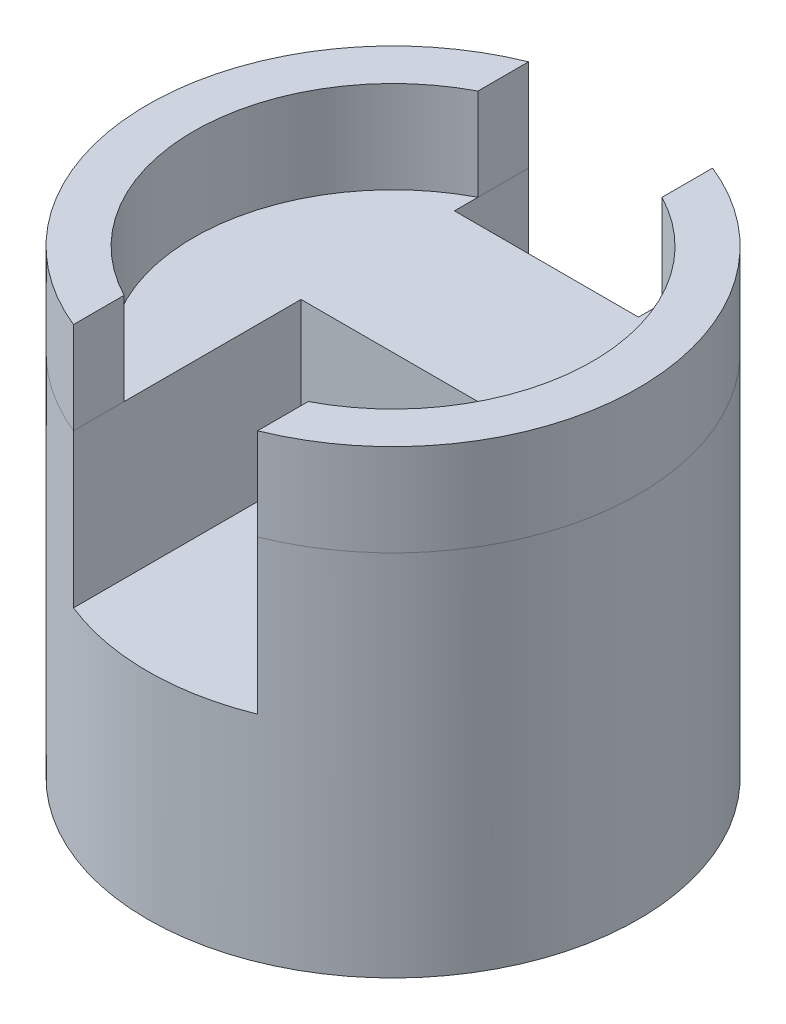
ISO-10303-21;
HEADER;
FILE_DESCRIPTION(('STEP AP214'),'2;1');
FILE_NAME('part.step','',(''),(''),'','','');
FILE_SCHEMA(('AUTOMOTIVE_DESIGN { 1 0 10303 214 1 1 1 1 }'));
ENDSEC;
DATA;
#1=APPLICATION_CONTEXT('core data for automotive mechanical design processes');
#2=APPLICATION_PROTOCOL_DEFINITION('international standard','automotive_design',2000,#1);
#3=PRODUCT_CONTEXT('',#1,'mechanical');
#4=PRODUCT('Part','Part','',(#3));
#5=PRODUCT_RELATED_PRODUCT_CATEGORY('part','',(#4));
#6=PRODUCT_DEFINITION_FORMATION('','',#4);
#7=PRODUCT_DEFINITION_CONTEXT('part definition',#1,'design');
#8=PRODUCT_DEFINITION('design','',#6,#7);
#9=PRODUCT_DEFINITION_SHAPE('','',#8);
#10=(LENGTH_UNIT() NAMED_UNIT(*) SI_UNIT(.MILLI.,.METRE.));
#11=(NAMED_UNIT(*) PLANE_ANGLE_UNIT() SI_UNIT($,.RADIAN.));
#12=(NAMED_UNIT(*) SI_UNIT($,.STERADIAN.) SOLID_ANGLE_UNIT());
#13=UNCERTAINTY_MEASURE_WITH_UNIT(LENGTH_MEASURE(1.E-05),#10,'distance_accuracy_value','');
#14=(GEOMETRIC_REPRESENTATION_CONTEXT(3) GLOBAL_UNCERTAINTY_ASSIGNED_CONTEXT((#13)) GLOBAL_UNIT_ASSIGNED_CONTEXT((#10,
#11,#12)) REPRESENTATION_CONTEXT('',''));
#15=CARTESIAN_POINT('',(0.,0.,0.));
#16=DIRECTION('',(0.,0.,1.));
#17=DIRECTION('',(1.,0.,0.));
#18=AXIS2_PLACEMENT_3D('',#15,#16,#17);
#19=CARTESIAN_POINT('',(0.,190.5,0.));
#20=DIRECTION('',(0.,1.,0.));
#21=DIRECTION('',(0.,0.,1.));
#22=AXIS2_PLACEMENT_3D('',#19,#20,#21);
#23=PLANE('',#22);
#24=DIRECTION('',(0.,0.,1.));
#25=VECTOR('',#24,1.);
#26=CARTESIAN_POINT('',(-38.1,190.5,-63.5));
#27=LINE('',#26,#25);
#28=CARTESIAN_POINT('',(-38.1,190.5,-94.1857207861149));
#29=VERTEX_POINT('',#28);
#30=CARTESIAN_POINT('',(-38.1,190.5,-73.2317724761596));
#31=VERTEX_POINT('',#30);
#32=EDGE_CURVE('E58',#29,#31,#27,.T.);
#33=ORIENTED_EDGE('',*,*,#32,.F.);
#34=CARTESIAN_POINT('',(0.,190.5,0.));
#35=DIRECTION('',(0.,1.,0.));
#36=DIRECTION('',(0.,0.,1.));
#37=AXIS2_PLACEMENT_3D('',#34,#35,#36);
#38=CIRCLE('',#37,101.6);
#39=CARTESIAN_POINT('',(-38.1,190.5,94.1857207861149));
#40=VERTEX_POINT('',#39);
#41=EDGE_CURVE('E112',#29,#40,#38,.T.);
#42=ORIENTED_EDGE('',*,*,#41,.T.);
#43=DIRECTION('',(0.,0.,1.));
#44=VECTOR('',#43,1.);
#45=CARTESIAN_POINT('',(-38.1,190.5,0.));
#46=LINE('',#45,#44);
#47=CARTESIAN_POINT('',(-38.1,190.5,73.2317724761595));
#48=VERTEX_POINT('',#47);
#49=EDGE_CURVE('E91',#48,#40,#46,.T.);
#50=ORIENTED_EDGE('',*,*,#49,.F.);
#51=CARTESIAN_POINT('',(0.,190.5,0.));
#52=DIRECTION('',(0.,1.,0.));
#53=DIRECTION('',(0.,0.,1.));
#54=AXIS2_PLACEMENT_3D('',#51,#52,#53);
#55=CIRCLE('',#54,82.55);
#56=EDGE_CURVE('E97',#31,#48,#55,.T.);
#57=ORIENTED_EDGE('',*,*,#56,.F.);
#58=EDGE_LOOP('',(#33,#42,#50,#57));
#59=FACE_BOUND('',#58,.T.);
#60=ADVANCED_FACE('F55',(#59),#23,.T.);
#61=CARTESIAN_POINT('',(0.,152.4,0.));
#62=DIRECTION('',(0.,1.,0.));
#63=DIRECTION('',(0.,0.,1.));
#64=AXIS2_PLACEMENT_3D('',#61,#62,#63);
#65=PLANE('',#64);
#66=CARTESIAN_POINT('',(0.,152.4,0.));
#67=DIRECTION('',(0.,1.,0.));
#68=DIRECTION('',(0.,0.,1.));
#69=AXIS2_PLACEMENT_3D('',#66,#67,#68);
#70=CIRCLE('',#69,101.6);
#71=CARTESIAN_POINT('',(-38.1,152.4,-94.1857207861149));
#72=VERTEX_POINT('',#71);
#73=CARTESIAN_POINT('',(-38.1,152.4,94.1857207861149));
#74=VERTEX_POINT('',#73);
#75=EDGE_CURVE('E110',#72,#74,#70,.T.);
#76=ORIENTED_EDGE('',*,*,#75,.F.);
#77=DIRECTION('',(0.,0.,1.));
#78=VECTOR('',#77,1.);
#79=CARTESIAN_POINT('',(-38.1,152.4,0.));
#80=LINE('',#79,#78);
#81=CARTESIAN_POINT('',(-38.1,152.4,-73.2317724761595));
#82=VERTEX_POINT('',#81);
#83=EDGE_CURVE('E71',#72,#82,#80,.T.);
#84=ORIENTED_EDGE('',*,*,#83,.T.);
#85=CARTESIAN_POINT('',(0.,152.4,0.));
#86=DIRECTION('',(0.,1.,0.));
#87=DIRECTION('',(0.,0.,1.));
#88=AXIS2_PLACEMENT_3D('',#85,#86,#87);
#89=CIRCLE('',#88,82.55);
#90=CARTESIAN_POINT('',(-38.1,152.4,73.2317724761595));
#91=VERTEX_POINT('',#90);
#92=EDGE_CURVE('E54',#82,#91,#89,.T.);
#93=ORIENTED_EDGE('',*,*,#92,.T.);
#94=DIRECTION('',(0.,0.,1.));
#95=VECTOR('',#94,1.);
#96=CARTESIAN_POINT('',(-38.1,152.4,0.));
#97=LINE('',#96,#95);
#98=EDGE_CURVE('E113',#91,#74,#97,.T.);
#99=ORIENTED_EDGE('',*,*,#98,.T.);
#100=EDGE_LOOP('',(#76,#84,#93,#99));
#101=FACE_BOUND('',#100,.T.);
#102=ADVANCED_FACE('F122',(#101),#65,.F.);
#103=CARTESIAN_POINT('',(0.,190.5,0.));
#104=DIRECTION('',(0.,-1.,0.));
#105=DIRECTION('',(0.,0.,-1.));
#106=AXIS2_PLACEMENT_3D('',#103,#104,#105);
#107=CYLINDRICAL_SURFACE('',#106,101.6);
#108=ORIENTED_EDGE('',*,*,#41,.F.);
#109=DIRECTION('',(0.,-1.,0.));
#110=VECTOR('',#109,1.);
#111=CARTESIAN_POINT('',(-38.1,190.5,-94.1857207861149));
#112=LINE('',#111,#110);
#113=EDGE_CURVE('E69',#29,#72,#112,.T.);
#114=ORIENTED_EDGE('',*,*,#113,.T.);
#115=ORIENTED_EDGE('',*,*,#75,.T.);
#116=DIRECTION('',(0.,-1.,0.));
#117=VECTOR('',#116,1.);
#118=CARTESIAN_POINT('',(-38.1,190.5,94.1857207861149));
#119=LINE('',#118,#117);
#120=EDGE_CURVE('E102',#74,#40,#119,.F.);
#121=ORIENTED_EDGE('',*,*,#120,.T.);
#122=EDGE_LOOP('',(#108,#114,#115,#121));
#123=FACE_BOUND('',#122,.T.);
#124=ADVANCED_FACE('F127',(#123),#107,.T.);
#125=CARTESIAN_POINT('',(0.,190.5,0.));
#126=DIRECTION('',(0.,-1.,0.));
#127=DIRECTION('',(0.,0.,-1.));
#128=AXIS2_PLACEMENT_3D('',#125,#126,#127);
#129=CYLINDRICAL_SURFACE('',#128,82.55);
#130=DIRECTION('',(0.,-1.,0.));
#131=VECTOR('',#130,1.);
#132=CARTESIAN_POINT('',(-38.1,190.5,-73.2317724761595));
#133=LINE('',#132,#131);
#134=EDGE_CURVE('E12',#31,#82,#133,.T.);
#135=ORIENTED_EDGE('',*,*,#134,.F.);
#136=ORIENTED_EDGE('',*,*,#56,.T.);
#137=DIRECTION('',(0.,-1.,0.));
#138=VECTOR('',#137,1.);
#139=CARTESIAN_POINT('',(-38.1,190.5,73.2317724761595));
#140=LINE('',#139,#138);
#141=EDGE_CURVE('E103',#91,#48,#140,.F.);
#142=ORIENTED_EDGE('',*,*,#141,.F.);
#143=ORIENTED_EDGE('',*,*,#92,.F.);
#144=EDGE_LOOP('',(#135,#136,#142,#143));
#145=FACE_BOUND('',#144,.T.);
#146=ADVANCED_FACE('F100',(#145),#129,.F.);
#147=CARTESIAN_POINT('',(-38.1,88.9,0.));
#148=DIRECTION('',(-1.,0.,0.));
#149=DIRECTION('',(0.,0.,1.));
#150=AXIS2_PLACEMENT_3D('',#147,#148,#149);
#151=PLANE('',#150);
#152=ORIENTED_EDGE('',*,*,#98,.F.);
#153=ORIENTED_EDGE('',*,*,#141,.T.);
#154=ORIENTED_EDGE('',*,*,#49,.T.);
#155=ORIENTED_EDGE('',*,*,#120,.F.);
#156=EDGE_LOOP('',(#152,#153,#154,#155));
#157=FACE_BOUND('',#156,.T.);
#158=ADVANCED_FACE('F121',(#157),#151,.F.);
#159=CARTESIAN_POINT('',(-38.1,0.,-63.5));
#160=DIRECTION('',(-1.,0.,0.));
#161=DIRECTION('',(0.,0.,1.));
#162=AXIS2_PLACEMENT_3D('',#159,#160,#161);
#163=PLANE('',#162);
#164=ORIENTED_EDGE('',*,*,#32,.T.);
#165=ORIENTED_EDGE('',*,*,#134,.T.);
#166=ORIENTED_EDGE('',*,*,#83,.F.);
#167=ORIENTED_EDGE('',*,*,#113,.F.);
#168=EDGE_LOOP('',(#164,#165,#166,#167));
#169=FACE_BOUND('',#168,.T.);
#170=ADVANCED_FACE('F90',(#169),#163,.F.);
#171=CLOSED_SHELL('',(#60,#102,#124,#146,#158,#170));
#172=MANIFOLD_SOLID_BREP('B2',#171);
#173=CARTESIAN_POINT('',(38.1,88.9,0.));
#174=DIRECTION('',(1.,0.,0.));
#175=DIRECTION('',(0.,0.,-1.));
#176=AXIS2_PLACEMENT_3D('',#173,#174,#175);
#177=PLANE('',#176);
#178=DIRECTION('',(0.,0.,-1.));
#179=VECTOR('',#178,1.);
#180=CARTESIAN_POINT('',(38.1,190.5,0.));
#181=LINE('',#180,#179);
#182=CARTESIAN_POINT('',(38.1,190.5,94.1857207861149));
#183=VERTEX_POINT('',#182);
#184=CARTESIAN_POINT('',(38.1,190.5,73.2317724761595));
#185=VERTEX_POINT('',#184);
#186=EDGE_CURVE('E210',#183,#185,#181,.T.);
#187=ORIENTED_EDGE('',*,*,#186,.T.);
#188=DIRECTION('',(0.,-1.,0.));
#189=VECTOR('',#188,1.);
#190=CARTESIAN_POINT('',(38.1,190.5,73.2317724761595));
#191=LINE('',#190,#189);
#192=CARTESIAN_POINT('',(38.1,152.4,73.2317724761595));
#193=VERTEX_POINT('',#192);
#194=EDGE_CURVE('E194',#185,#193,#191,.T.);
#195=ORIENTED_EDGE('',*,*,#194,.T.);
#196=DIRECTION('',(0.,0.,-1.));
#197=VECTOR('',#196,1.);
#198=CARTESIAN_POINT('',(38.1,152.4,0.));
#199=LINE('',#198,#197);
#200=CARTESIAN_POINT('',(38.1,152.4,94.1857207861149));
#201=VERTEX_POINT('',#200);
#202=EDGE_CURVE('E248',#201,#193,#199,.T.);
#203=ORIENTED_EDGE('',*,*,#202,.F.);
#204=DIRECTION('',(0.,-1.,0.));
#205=VECTOR('',#204,1.);
#206=CARTESIAN_POINT('',(38.1,190.5,94.1857207861149));
#207=LINE('',#206,#205);
#208=EDGE_CURVE('E241',#183,#201,#207,.T.);
#209=ORIENTED_EDGE('',*,*,#208,.F.);
#210=EDGE_LOOP('',(#187,#195,#203,#209));
#211=FACE_BOUND('',#210,.T.);
#212=ADVANCED_FACE('F183',(#211),#177,.F.);
#213=CARTESIAN_POINT('',(0.,190.5,0.));
#214=DIRECTION('',(0.,-1.,0.));
#215=DIRECTION('',(0.,0.,-1.));
#216=AXIS2_PLACEMENT_3D('',#213,#214,#215);
#217=CYLINDRICAL_SURFACE('',#216,101.6);
#218=CARTESIAN_POINT('',(0.,152.4,0.));
#219=DIRECTION('',(0.,1.,0.));
#220=DIRECTION('',(0.,0.,1.));
#221=AXIS2_PLACEMENT_3D('',#218,#219,#220);
#222=CIRCLE('',#221,101.6);
#223=CARTESIAN_POINT('',(38.1,152.4,-94.1857207861149));
#224=VERTEX_POINT('',#223);
#225=EDGE_CURVE('E239',#201,#224,#222,.T.);
#226=ORIENTED_EDGE('',*,*,#225,.T.);
#227=DIRECTION('',(0.,-1.,0.));
#228=VECTOR('',#227,1.);
#229=CARTESIAN_POINT('',(38.1,190.5,-94.1857207861149));
#230=LINE('',#229,#228);
#231=CARTESIAN_POINT('',(38.1,190.5,-94.1857207861149));
#232=VERTEX_POINT('',#231);
#233=EDGE_CURVE('E254',#224,#232,#230,.F.);
#234=ORIENTED_EDGE('',*,*,#233,.T.);
#235=CARTESIAN_POINT('',(0.,190.5,0.));
#236=DIRECTION('',(0.,1.,0.));
#237=DIRECTION('',(0.,0.,1.));
#238=AXIS2_PLACEMENT_3D('',#235,#236,#237);
#239=CIRCLE('',#238,101.6);
#240=EDGE_CURVE('E237',#183,#232,#239,.T.);
#241=ORIENTED_EDGE('',*,*,#240,.F.);
#242=ORIENTED_EDGE('',*,*,#208,.T.);
#243=EDGE_LOOP('',(#226,#234,#241,#242));
#244=FACE_BOUND('',#243,.T.);
#245=ADVANCED_FACE('F189',(#244),#217,.T.);
#246=CARTESIAN_POINT('',(0.,190.5,0.));
#247=DIRECTION('',(0.,-1.,0.));
#248=DIRECTION('',(0.,0.,-1.));
#249=AXIS2_PLACEMENT_3D('',#246,#247,#248);
#250=CYLINDRICAL_SURFACE('',#249,82.55);
#251=DIRECTION('',(0.,-1.,0.));
#252=VECTOR('',#251,1.);
#253=CARTESIAN_POINT('',(38.1,190.5,-73.2317724761595));
#254=LINE('',#253,#252);
#255=CARTESIAN_POINT('',(38.1,152.4,-73.2317724761596));
#256=VERTEX_POINT('',#255);
#257=CARTESIAN_POINT('',(38.1,190.5,-73.2317724761596));
#258=VERTEX_POINT('',#257);
#259=EDGE_CURVE('E49',#256,#258,#254,.F.);
#260=ORIENTED_EDGE('',*,*,#259,.F.);
#261=CARTESIAN_POINT('',(0.,152.4,0.));
#262=DIRECTION('',(0.,1.,0.));
#263=DIRECTION('',(0.,0.,1.));
#264=AXIS2_PLACEMENT_3D('',#261,#262,#263);
#265=CIRCLE('',#264,82.55);
#266=EDGE_CURVE('E238',#193,#256,#265,.T.);
#267=ORIENTED_EDGE('',*,*,#266,.F.);
#268=ORIENTED_EDGE('',*,*,#194,.F.);
#269=CARTESIAN_POINT('',(0.,190.5,0.));
#270=DIRECTION('',(0.,1.,0.));
#271=DIRECTION('',(0.,0.,1.));
#272=AXIS2_PLACEMENT_3D('',#269,#270,#271);
#273=CIRCLE('',#272,82.55);
#274=EDGE_CURVE('E231',#185,#258,#273,.T.);
#275=ORIENTED_EDGE('',*,*,#274,.T.);
#276=EDGE_LOOP('',(#260,#267,#268,#275));
#277=FACE_BOUND('',#276,.T.);
#278=ADVANCED_FACE('F236',(#277),#250,.F.);
#279=CARTESIAN_POINT('',(0.,152.4,0.));
#280=DIRECTION('',(0.,1.,0.));
#281=DIRECTION('',(0.,0.,1.));
#282=AXIS2_PLACEMENT_3D('',#279,#280,#281);
#283=PLANE('',#282);
#284=ORIENTED_EDGE('',*,*,#266,.T.);
#285=DIRECTION('',(0.,0.,-1.));
#286=VECTOR('',#285,1.);
#287=CARTESIAN_POINT('',(38.1,152.4,0.));
#288=LINE('',#287,#286);
#289=EDGE_CURVE('E200',#256,#224,#288,.T.);
#290=ORIENTED_EDGE('',*,*,#289,.T.);
#291=ORIENTED_EDGE('',*,*,#225,.F.);
#292=ORIENTED_EDGE('',*,*,#202,.T.);
#293=EDGE_LOOP('',(#284,#290,#291,#292));
#294=FACE_BOUND('',#293,.T.);
#295=ADVANCED_FACE('F255',(#294),#283,.F.);
#296=CARTESIAN_POINT('',(0.,190.5,0.));
#297=DIRECTION('',(0.,1.,0.));
#298=DIRECTION('',(0.,0.,1.));
#299=AXIS2_PLACEMENT_3D('',#296,#297,#298);
#300=PLANE('',#299);
#301=DIRECTION('',(0.,0.,-1.));
#302=VECTOR('',#301,1.);
#303=CARTESIAN_POINT('',(38.1,190.5,-63.5));
#304=LINE('',#303,#302);
#305=EDGE_CURVE('E221',#258,#232,#304,.T.);
#306=ORIENTED_EDGE('',*,*,#305,.F.);
#307=ORIENTED_EDGE('',*,*,#274,.F.);
#308=ORIENTED_EDGE('',*,*,#186,.F.);
#309=ORIENTED_EDGE('',*,*,#240,.T.);
#310=EDGE_LOOP('',(#306,#307,#308,#309));
#311=FACE_BOUND('',#310,.T.);
#312=ADVANCED_FACE('F234',(#311),#300,.T.);
#313=CARTESIAN_POINT('',(38.1,0.,-63.5));
#314=DIRECTION('',(1.,0.,0.));
#315=DIRECTION('',(0.,0.,-1.));
#316=AXIS2_PLACEMENT_3D('',#313,#314,#315);
#317=PLANE('',#316);
#318=ORIENTED_EDGE('',*,*,#289,.F.);
#319=ORIENTED_EDGE('',*,*,#259,.T.);
#320=ORIENTED_EDGE('',*,*,#305,.T.);
#321=ORIENTED_EDGE('',*,*,#233,.F.);
#322=EDGE_LOOP('',(#318,#319,#320,#321));
#323=FACE_BOUND('',#322,.T.);
#324=ADVANCED_FACE('F224',(#323),#317,.F.);
#325=CLOSED_SHELL('',(#212,#245,#278,#295,#312,#324));
#326=MANIFOLD_SOLID_BREP('B6',#325);
#327=CARTESIAN_POINT('',(0.,152.4,0.));
#328=DIRECTION('',(0.,-1.,0.));
#329=DIRECTION('',(0.,0.,-1.));
#330=AXIS2_PLACEMENT_3D('',#327,#328,#329);
#331=CYLINDRICAL_SURFACE('',#330,101.6);
#332=CARTESIAN_POINT('',(0.,152.4,0.));
#333=DIRECTION('',(0.,1.,0.));
#334=DIRECTION('',(0.,0.,1.));
#335=AXIS2_PLACEMENT_3D('',#332,#333,#334);
#336=CIRCLE('',#335,101.6);
#337=CARTESIAN_POINT('',(-38.1,152.4,-94.1857207861149));
#338=VERTEX_POINT('',#337);
#339=CARTESIAN_POINT('',(-38.1,152.4,94.1857207861149));
#340=VERTEX_POINT('',#339);
#341=EDGE_CURVE('E393',#338,#340,#336,.T.);
#342=ORIENTED_EDGE('',*,*,#341,.F.);
#343=DIRECTION('',(0.,-1.,0.));
#344=VECTOR('',#343,1.);
#345=CARTESIAN_POINT('',(-38.1,152.4,-94.1857207861149));
#346=LINE('',#345,#344);
#347=CARTESIAN_POINT('',(-38.1,0.,-94.1857207861149));
#348=VERTEX_POINT('',#347);
#349=EDGE_CURVE('E434',#338,#348,#346,.T.);
#350=ORIENTED_EDGE('',*,*,#349,.T.);
#351=CARTESIAN_POINT('',(0.,0.,0.));
#352=DIRECTION('',(0.,1.,0.));
#353=DIRECTION('',(0.,0.,1.));
#354=AXIS2_PLACEMENT_3D('',#351,#352,#353);
#355=CIRCLE('',#354,101.6);
#356=CARTESIAN_POINT('',(38.1,0.,-94.1857207861149));
#357=VERTEX_POINT('',#356);
#358=EDGE_CURVE('E394',#348,#357,#355,.T.);
#359=ORIENTED_EDGE('',*,*,#358,.T.);
#360=DIRECTION('',(0.,-1.,0.));
#361=VECTOR('',#360,1.);
#362=CARTESIAN_POINT('',(38.1,152.4,-94.1857207861149));
#363=LINE('',#362,#361);
#364=CARTESIAN_POINT('',(38.1,152.4,-94.1857207861149));
#365=VERTEX_POINT('',#364);
#366=EDGE_CURVE('E437',#357,#365,#363,.F.);
#367=ORIENTED_EDGE('',*,*,#366,.T.);
#368=CARTESIAN_POINT('',(38.1,152.4,94.1857207861149));
#369=VERTEX_POINT('',#368);
#370=EDGE_CURVE('E399',#369,#365,#336,.T.);
#371=ORIENTED_EDGE('',*,*,#370,.F.);
#372=DIRECTION('',(0.,-1.,0.));
#373=VECTOR('',#372,1.);
#374=CARTESIAN_POINT('',(38.1,152.4,94.1857207861149));
#375=LINE('',#374,#373);
#376=CARTESIAN_POINT('',(38.1,88.9,94.1857207861149));
#377=VERTEX_POINT('',#376);
#378=EDGE_CURVE('E332',#369,#377,#375,.T.);
#379=ORIENTED_EDGE('',*,*,#378,.T.);
#380=CARTESIAN_POINT('',(0.,88.9,0.));
#381=DIRECTION('',(0.,1.,0.));
#382=DIRECTION('',(0.,0.,1.));
#383=AXIS2_PLACEMENT_3D('',#380,#381,#382);
#384=CIRCLE('',#383,101.6);
#385=CARTESIAN_POINT('',(-38.1,88.9,94.1857207861149));
#386=VERTEX_POINT('',#385);
#387=EDGE_CURVE('E316',#386,#377,#384,.T.);
#388=ORIENTED_EDGE('',*,*,#387,.F.);
#389=DIRECTION('',(0.,-1.,0.));
#390=VECTOR('',#389,1.);
#391=CARTESIAN_POINT('',(-38.1,152.4,94.1857207861149));
#392=LINE('',#391,#390);
#393=EDGE_CURVE('E397',#386,#340,#392,.F.);
#394=ORIENTED_EDGE('',*,*,#393,.T.);
#395=EDGE_LOOP('',(#342,#350,#359,#367,#371,#379,#388,#394));
#396=FACE_BOUND('',#395,.T.);
#397=ADVANCED_FACE('F310',(#396),#331,.T.);
#398=CARTESIAN_POINT('',(0.,152.4,0.));
#399=DIRECTION('',(0.,1.,0.));
#400=DIRECTION('',(0.,0.,1.));
#401=AXIS2_PLACEMENT_3D('',#398,#399,#400);
#402=PLANE('',#401);
#403=DIRECTION('',(0.,0.,1.));
#404=VECTOR('',#403,1.);
#405=CARTESIAN_POINT('',(-38.1,152.4,0.));
#406=LINE('',#405,#404);
#407=CARTESIAN_POINT('',(-38.1,152.4,-63.5));
#408=VERTEX_POINT('',#407);
#409=EDGE_CURVE('E377',#338,#408,#406,.T.);
#410=ORIENTED_EDGE('',*,*,#409,.F.);
#411=ORIENTED_EDGE('',*,*,#341,.T.);
#412=DIRECTION('',(0.,0.,1.));
#413=VECTOR('',#412,1.);
#414=CARTESIAN_POINT('',(-38.1,152.4,0.));
#415=LINE('',#414,#413);
#416=CARTESIAN_POINT('',(-38.1,152.4,0.));
#417=VERTEX_POINT('',#416);
#418=EDGE_CURVE('E409',#417,#340,#415,.T.);
#419=ORIENTED_EDGE('',*,*,#418,.F.);
#420=DIRECTION('',(-1.,0.,0.));
#421=VECTOR('',#420,1.);
#422=CARTESIAN_POINT('',(0.,152.4,0.));
#423=LINE('',#422,#421);
#424=CARTESIAN_POINT('',(38.1,152.4,0.));
#425=VERTEX_POINT('',#424);
#426=EDGE_CURVE('E403',#425,#417,#423,.T.);
#427=ORIENTED_EDGE('',*,*,#426,.F.);
#428=DIRECTION('',(0.,0.,-1.));
#429=VECTOR('',#428,1.);
#430=CARTESIAN_POINT('',(38.1,152.4,0.));
#431=LINE('',#430,#429);
#432=EDGE_CURVE('E401',#369,#425,#431,.T.);
#433=ORIENTED_EDGE('',*,*,#432,.F.);
#434=ORIENTED_EDGE('',*,*,#370,.T.);
#435=DIRECTION('',(0.,0.,-1.));
#436=VECTOR('',#435,1.);
#437=CARTESIAN_POINT('',(38.1,152.4,0.));
#438=LINE('',#437,#436);
#439=CARTESIAN_POINT('',(38.1,152.4,-63.5));
#440=VERTEX_POINT('',#439);
#441=EDGE_CURVE('E439',#440,#365,#438,.T.);
#442=ORIENTED_EDGE('',*,*,#441,.F.);
#443=DIRECTION('',(1.,0.,0.));
#444=VECTOR('',#443,1.);
#445=CARTESIAN_POINT('',(0.,152.4,-63.5));
#446=LINE('',#445,#444);
#447=EDGE_CURVE('E445',#408,#440,#446,.T.);
#448=ORIENTED_EDGE('',*,*,#447,.F.);
#449=EDGE_LOOP('',(#410,#411,#419,#427,#433,#434,#442,#448));
#450=FACE_BOUND('',#449,.T.);
#451=ADVANCED_FACE('F450',(#450),#402,.T.);
#452=CARTESIAN_POINT('',(0.,0.,0.));
#453=DIRECTION('',(0.,1.,0.));
#454=DIRECTION('',(0.,0.,1.));
#455=AXIS2_PLACEMENT_3D('',#452,#453,#454);
#456=PLANE('',#455);
#457=ORIENTED_EDGE('',*,*,#358,.F.);
#458=DIRECTION('',(0.,0.,1.));
#459=VECTOR('',#458,1.);
#460=CARTESIAN_POINT('',(-38.1,0.,0.));
#461=LINE('',#460,#459);
#462=CARTESIAN_POINT('',(-38.1,0.,-63.5));
#463=VERTEX_POINT('',#462);
#464=EDGE_CURVE('E181',#348,#463,#461,.T.);
#465=ORIENTED_EDGE('',*,*,#464,.T.);
#466=DIRECTION('',(1.,0.,0.));
#467=VECTOR('',#466,1.);
#468=CARTESIAN_POINT('',(-38.1,0.,-63.5));
#469=LINE('',#468,#467);
#470=CARTESIAN_POINT('',(38.1,0.,-63.5));
#471=VERTEX_POINT('',#470);
#472=EDGE_CURVE('E384',#463,#471,#469,.T.);
#473=ORIENTED_EDGE('',*,*,#472,.T.);
#474=DIRECTION('',(0.,0.,-1.));
#475=VECTOR('',#474,1.);
#476=CARTESIAN_POINT('',(38.1,0.,-63.5));
#477=LINE('',#476,#475);
#478=EDGE_CURVE('E323',#471,#357,#477,.T.);
#479=ORIENTED_EDGE('',*,*,#478,.T.);
#480=EDGE_LOOP('',(#457,#465,#473,#479));
#481=FACE_BOUND('',#480,.T.);
#482=ADVANCED_FACE('F388',(#481),#456,.F.);
#483=CARTESIAN_POINT('',(0.,88.9,0.));
#484=DIRECTION('',(0.,1.,0.));
#485=DIRECTION('',(0.,0.,1.));
#486=AXIS2_PLACEMENT_3D('',#483,#484,#485);
#487=PLANE('',#486);
#488=ORIENTED_EDGE('',*,*,#387,.T.);
#489=DIRECTION('',(0.,0.,-1.));
#490=VECTOR('',#489,1.);
#491=CARTESIAN_POINT('',(38.1,88.9,0.));
#492=LINE('',#491,#490);
#493=CARTESIAN_POINT('',(38.1,88.9,0.));
#494=VERTEX_POINT('',#493);
#495=EDGE_CURVE('E411',#377,#494,#492,.T.);
#496=ORIENTED_EDGE('',*,*,#495,.T.);
#497=DIRECTION('',(-1.,0.,0.));
#498=VECTOR('',#497,1.);
#499=CARTESIAN_POINT('',(-38.1,88.9,0.));
#500=LINE('',#499,#498);
#501=CARTESIAN_POINT('',(-38.1,88.9,0.));
#502=VERTEX_POINT('',#501);
#503=EDGE_CURVE('E425',#494,#502,#500,.T.);
#504=ORIENTED_EDGE('',*,*,#503,.T.);
#505=DIRECTION('',(0.,0.,1.));
#506=VECTOR('',#505,1.);
#507=CARTESIAN_POINT('',(-38.1,88.9,0.));
#508=LINE('',#507,#506);
#509=EDGE_CURVE('E417',#502,#386,#508,.T.);
#510=ORIENTED_EDGE('',*,*,#509,.T.);
#511=EDGE_LOOP('',(#488,#496,#504,#510));
#512=FACE_BOUND('',#511,.T.);
#513=ADVANCED_FACE('F415',(#512),#487,.T.);
#514=CARTESIAN_POINT('',(-38.1,88.9,0.));
#515=DIRECTION('',(-1.,0.,0.));
#516=DIRECTION('',(0.,0.,1.));
#517=AXIS2_PLACEMENT_3D('',#514,#515,#516);
#518=PLANE('',#517);
#519=ORIENTED_EDGE('',*,*,#509,.F.);
#520=DIRECTION('',(0.,1.,0.));
#521=VECTOR('',#520,1.);
#522=CARTESIAN_POINT('',(-38.1,88.9,0.));
#523=LINE('',#522,#521);
#524=EDGE_CURVE('E430',#502,#417,#523,.T.);
#525=ORIENTED_EDGE('',*,*,#524,.T.);
#526=ORIENTED_EDGE('',*,*,#418,.T.);
#527=ORIENTED_EDGE('',*,*,#393,.F.);
#528=EDGE_LOOP('',(#519,#525,#526,#527));
#529=FACE_BOUND('',#528,.T.);
#530=ADVANCED_FACE('F451',(#529),#518,.F.);
#531=CARTESIAN_POINT('',(38.1,88.9,0.));
#532=DIRECTION('',(1.,0.,0.));
#533=DIRECTION('',(0.,0.,-1.));
#534=AXIS2_PLACEMENT_3D('',#531,#532,#533);
#535=PLANE('',#534);
#536=ORIENTED_EDGE('',*,*,#432,.T.);
#537=DIRECTION('',(0.,1.,0.));
#538=VECTOR('',#537,1.);
#539=CARTESIAN_POINT('',(38.1,88.9,0.));
#540=LINE('',#539,#538);
#541=EDGE_CURVE('E419',#494,#425,#540,.T.);
#542=ORIENTED_EDGE('',*,*,#541,.F.);
#543=ORIENTED_EDGE('',*,*,#495,.F.);
#544=ORIENTED_EDGE('',*,*,#378,.F.);
#545=EDGE_LOOP('',(#536,#542,#543,#544));
#546=FACE_BOUND('',#545,.T.);
#547=ADVANCED_FACE('F416',(#546),#535,.F.);
#548=CARTESIAN_POINT('',(-38.1,88.9,0.));
#549=DIRECTION('',(0.,0.,-1.));
#550=DIRECTION('',(-1.,0.,0.));
#551=AXIS2_PLACEMENT_3D('',#548,#549,#550);
#552=PLANE('',#551);
#553=ORIENTED_EDGE('',*,*,#426,.T.);
#554=ORIENTED_EDGE('',*,*,#524,.F.);
#555=ORIENTED_EDGE('',*,*,#503,.F.);
#556=ORIENTED_EDGE('',*,*,#541,.T.);
#557=EDGE_LOOP('',(#553,#554,#555,#556));
#558=FACE_BOUND('',#557,.T.);
#559=ADVANCED_FACE('F455',(#558),#552,.F.);
#560=CARTESIAN_POINT('',(-38.1,0.,-63.5));
#561=DIRECTION('',(-1.,0.,0.));
#562=DIRECTION('',(0.,0.,1.));
#563=AXIS2_PLACEMENT_3D('',#560,#561,#562);
#564=PLANE('',#563);
#565=ORIENTED_EDGE('',*,*,#409,.T.);
#566=DIRECTION('',(0.,1.,0.));
#567=VECTOR('',#566,1.);
#568=CARTESIAN_POINT('',(-38.1,0.,-63.5));
#569=LINE('',#568,#567);
#570=EDGE_CURVE('E372',#463,#408,#569,.T.);
#571=ORIENTED_EDGE('',*,*,#570,.F.);
#572=ORIENTED_EDGE('',*,*,#464,.F.);
#573=ORIENTED_EDGE('',*,*,#349,.F.);
#574=EDGE_LOOP('',(#565,#571,#572,#573));
#575=FACE_BOUND('',#574,.T.);
#576=ADVANCED_FACE('F376',(#575),#564,.F.);
#577=CARTESIAN_POINT('',(38.1,0.,-63.5));
#578=DIRECTION('',(1.,0.,0.));
#579=DIRECTION('',(0.,0.,-1.));
#580=AXIS2_PLACEMENT_3D('',#577,#578,#579);
#581=PLANE('',#580);
#582=ORIENTED_EDGE('',*,*,#478,.F.);
#583=DIRECTION('',(0.,1.,0.));
#584=VECTOR('',#583,1.);
#585=CARTESIAN_POINT('',(38.1,0.,-63.5));
#586=LINE('',#585,#584);
#587=EDGE_CURVE('E385',#471,#440,#586,.T.);
#588=ORIENTED_EDGE('',*,*,#587,.T.);
#589=ORIENTED_EDGE('',*,*,#441,.T.);
#590=ORIENTED_EDGE('',*,*,#366,.F.);
#591=EDGE_LOOP('',(#582,#588,#589,#590));
#592=FACE_BOUND('',#591,.T.);
#593=ADVANCED_FACE('F447',(#592),#581,.F.);
#594=CARTESIAN_POINT('',(-38.1,0.,-63.5));
#595=DIRECTION('',(0.,0.,1.));
#596=DIRECTION('',(1.,0.,0.));
#597=AXIS2_PLACEMENT_3D('',#594,#595,#596);
#598=PLANE('',#597);
#599=ORIENTED_EDGE('',*,*,#447,.T.);
#600=ORIENTED_EDGE('',*,*,#587,.F.);
#601=ORIENTED_EDGE('',*,*,#472,.F.);
#602=ORIENTED_EDGE('',*,*,#570,.T.);
#603=EDGE_LOOP('',(#599,#600,#601,#602));
#604=FACE_BOUND('',#603,.T.);
#605=ADVANCED_FACE('F387',(#604),#598,.F.);
#606=CLOSED_SHELL('',(#397,#451,#482,#513,#530,#547,#559,#576,#593,#605));
#607=MANIFOLD_SOLID_BREP('B42',#606);
#608=ADVANCED_BREP_SHAPE_REPRESENTATION('',(#18,#172,#326,#607),#14);
#609=SHAPE_DEFINITION_REPRESENTATION(#9,#608);
ENDSEC;
END-ISO-10303-21;
